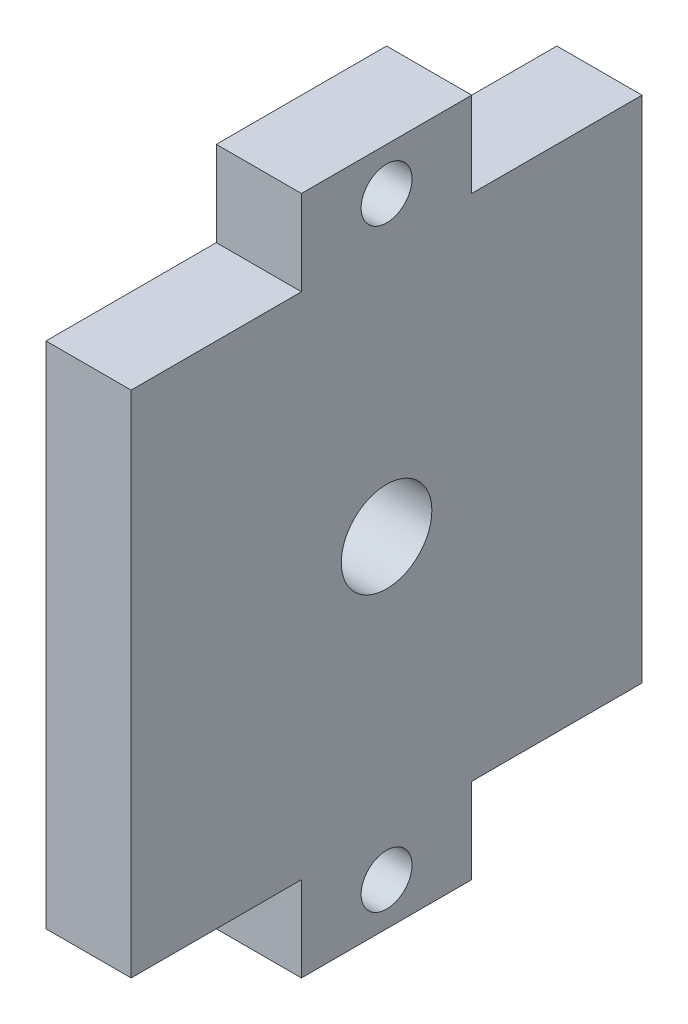
ISO-10303-21;
HEADER;
FILE_DESCRIPTION(('STEP AP214'),'2;1');
FILE_NAME('part.step','',(''),(''),'','','');
FILE_SCHEMA(('AUTOMOTIVE_DESIGN { 1 0 10303 214 1 1 1 1 }'));
ENDSEC;
DATA;
#1=APPLICATION_CONTEXT('core data for automotive mechanical design processes');
#2=APPLICATION_PROTOCOL_DEFINITION('international standard','automotive_design',2000,#1);
#3=PRODUCT_CONTEXT('',#1,'mechanical');
#4=PRODUCT('Part','Part','',(#3));
#5=PRODUCT_RELATED_PRODUCT_CATEGORY('part','',(#4));
#6=PRODUCT_DEFINITION_FORMATION('','',#4);
#7=PRODUCT_DEFINITION_CONTEXT('part definition',#1,'design');
#8=PRODUCT_DEFINITION('design','',#6,#7);
#9=PRODUCT_DEFINITION_SHAPE('','',#8);
#10=(LENGTH_UNIT() NAMED_UNIT(*) SI_UNIT(.MILLI.,.METRE.));
#11=(NAMED_UNIT(*) PLANE_ANGLE_UNIT() SI_UNIT($,.RADIAN.));
#12=(NAMED_UNIT(*) SI_UNIT($,.STERADIAN.) SOLID_ANGLE_UNIT());
#13=UNCERTAINTY_MEASURE_WITH_UNIT(LENGTH_MEASURE(1.E-05),#10,'distance_accuracy_value','');
#14=(GEOMETRIC_REPRESENTATION_CONTEXT(3) GLOBAL_UNCERTAINTY_ASSIGNED_CONTEXT((#13)) GLOBAL_UNIT_ASSIGNED_CONTEXT((#10,
#11,#12)) REPRESENTATION_CONTEXT('',''));
#15=CARTESIAN_POINT('',(0.,0.,0.));
#16=DIRECTION('',(0.,0.,1.));
#17=DIRECTION('',(1.,0.,0.));
#18=AXIS2_PLACEMENT_3D('',#15,#16,#17);
#19=CARTESIAN_POINT('',(3.175,0.,0.));
#20=DIRECTION('',(-1.,0.,0.));
#21=DIRECTION('',(0.,0.,1.));
#22=AXIS2_PLACEMENT_3D('',#19,#20,#21);
#23=PLANE('',#22);
#24=CARTESIAN_POINT('',(3.175,0.,0.));
#25=DIRECTION('',(1.,0.,0.));
#26=DIRECTION('',(0.,0.,-1.));
#27=AXIS2_PLACEMENT_3D('',#24,#25,#26);
#28=CIRCLE('',#27,3.37819999999999);
#29=CARTESIAN_POINT('',(3.175,0.,-3.37819999999999));
#30=VERTEX_POINT('',#29);
#31=EDGE_CURVE('E229',#30,#30,#28,.T.);
#32=ORIENTED_EDGE('',*,*,#31,.F.);
#33=EDGE_LOOP('',(#32));
#34=FACE_BOUND('',#33,.T.);
#35=CARTESIAN_POINT('',(3.175,22.1615,0.));
#36=DIRECTION('',(1.,0.,0.));
#37=DIRECTION('',(0.,0.,-1.));
#38=AXIS2_PLACEMENT_3D('',#35,#36,#37);
#39=CIRCLE('',#38,1.89865);
#40=CARTESIAN_POINT('',(3.175,22.1615,-1.89865));
#41=VERTEX_POINT('',#40);
#42=EDGE_CURVE('E197',#41,#41,#39,.T.);
#43=ORIENTED_EDGE('',*,*,#42,.F.);
#44=EDGE_LOOP('',(#43));
#45=FACE_BOUND('',#44,.T.);
#46=DIRECTION('',(0.,0.,-1.));
#47=VECTOR('',#46,1.);
#48=CARTESIAN_POINT('',(3.175,-25.3365,19.05));
#49=LINE('',#48,#47);
#50=CARTESIAN_POINT('',(3.175,-25.3365,6.35));
#51=VERTEX_POINT('',#50);
#52=CARTESIAN_POINT('',(3.175,-25.3365,-6.35));
#53=VERTEX_POINT('',#52);
#54=EDGE_CURVE('E11',#51,#53,#49,.T.);
#55=ORIENTED_EDGE('',*,*,#54,.T.);
#56=DIRECTION('',(0.,-1.,0.));
#57=VECTOR('',#56,1.);
#58=CARTESIAN_POINT('',(3.175,-25.3365,-6.35));
#59=LINE('',#58,#57);
#60=CARTESIAN_POINT('',(3.175,-18.9865,-6.35));
#61=VERTEX_POINT('',#60);
#62=EDGE_CURVE('E128',#61,#53,#59,.T.);
#63=ORIENTED_EDGE('',*,*,#62,.F.);
#64=DIRECTION('',(0.,0.,1.));
#65=VECTOR('',#64,1.);
#66=CARTESIAN_POINT('',(3.175,-18.9865,-19.05));
#67=LINE('',#66,#65);
#68=CARTESIAN_POINT('',(3.175,-18.9865,-19.05));
#69=VERTEX_POINT('',#68);
#70=EDGE_CURVE('E140',#69,#61,#67,.T.);
#71=ORIENTED_EDGE('',*,*,#70,.F.);
#72=DIRECTION('',(0.,1.,0.));
#73=VECTOR('',#72,1.);
#74=CARTESIAN_POINT('',(3.175,-25.3365,-19.05));
#75=LINE('',#74,#73);
#76=CARTESIAN_POINT('',(3.175,18.9865,-19.05));
#77=VERTEX_POINT('',#76);
#78=EDGE_CURVE('E144',#69,#77,#75,.T.);
#79=ORIENTED_EDGE('',*,*,#78,.T.);
#80=DIRECTION('',(0.,0.,1.));
#81=VECTOR('',#80,1.);
#82=CARTESIAN_POINT('',(3.175,18.9865,-19.05));
#83=LINE('',#82,#81);
#84=CARTESIAN_POINT('',(3.175,18.9865,-6.35));
#85=VERTEX_POINT('',#84);
#86=EDGE_CURVE('E181',#77,#85,#83,.T.);
#87=ORIENTED_EDGE('',*,*,#86,.T.);
#88=DIRECTION('',(0.,1.,0.));
#89=VECTOR('',#88,1.);
#90=CARTESIAN_POINT('',(3.175,25.3365,-6.35));
#91=LINE('',#90,#89);
#92=CARTESIAN_POINT('',(3.175,25.3365,-6.35));
#93=VERTEX_POINT('',#92);
#94=EDGE_CURVE('E187',#85,#93,#91,.T.);
#95=ORIENTED_EDGE('',*,*,#94,.T.);
#96=DIRECTION('',(0.,0.,1.));
#97=VECTOR('',#96,1.);
#98=CARTESIAN_POINT('',(3.175,25.3365,19.05));
#99=LINE('',#98,#97);
#100=CARTESIAN_POINT('',(3.175,25.3365,6.35));
#101=VERTEX_POINT('',#100);
#102=EDGE_CURVE('E146',#93,#101,#99,.T.);
#103=ORIENTED_EDGE('',*,*,#102,.T.);
#104=DIRECTION('',(0.,1.,0.));
#105=VECTOR('',#104,1.);
#106=CARTESIAN_POINT('',(3.175,25.3365,6.35));
#107=LINE('',#106,#105);
#108=CARTESIAN_POINT('',(3.175,18.9865,6.35));
#109=VERTEX_POINT('',#108);
#110=EDGE_CURVE('E165',#109,#101,#107,.T.);
#111=ORIENTED_EDGE('',*,*,#110,.F.);
#112=DIRECTION('',(0.,0.,-1.));
#113=VECTOR('',#112,1.);
#114=CARTESIAN_POINT('',(3.175,18.9865,19.05));
#115=LINE('',#114,#113);
#116=CARTESIAN_POINT('',(3.175,18.9865,19.05));
#117=VERTEX_POINT('',#116);
#118=EDGE_CURVE('E171',#117,#109,#115,.T.);
#119=ORIENTED_EDGE('',*,*,#118,.F.);
#120=DIRECTION('',(0.,-1.,0.));
#121=VECTOR('',#120,1.);
#122=CARTESIAN_POINT('',(3.175,-25.3365,19.05));
#123=LINE('',#122,#121);
#124=CARTESIAN_POINT('',(3.175,-18.9865,19.05));
#125=VERTEX_POINT('',#124);
#126=EDGE_CURVE('E41',#117,#125,#123,.T.);
#127=ORIENTED_EDGE('',*,*,#126,.T.);
#128=DIRECTION('',(0.,0.,-1.));
#129=VECTOR('',#128,1.);
#130=CARTESIAN_POINT('',(3.175,-18.9865,19.05));
#131=LINE('',#130,#129);
#132=CARTESIAN_POINT('',(3.175,-18.9865,6.35));
#133=VERTEX_POINT('',#132);
#134=EDGE_CURVE('E203',#125,#133,#131,.T.);
#135=ORIENTED_EDGE('',*,*,#134,.T.);
#136=DIRECTION('',(0.,-1.,0.));
#137=VECTOR('',#136,1.);
#138=CARTESIAN_POINT('',(3.175,-25.3365,6.35));
#139=LINE('',#138,#137);
#140=EDGE_CURVE('E209',#133,#51,#139,.T.);
#141=ORIENTED_EDGE('',*,*,#140,.T.);
#142=EDGE_LOOP('',(#55,#63,#71,#79,#87,#95,#103,#111,#119,#127,#135,#141));
#143=FACE_BOUND('',#142,.T.);
#144=CARTESIAN_POINT('',(3.175,-22.1615,0.));
#145=DIRECTION('',(1.,0.,0.));
#146=DIRECTION('',(0.,0.,-1.));
#147=AXIS2_PLACEMENT_3D('',#144,#145,#146);
#148=CIRCLE('',#147,1.89865);
#149=CARTESIAN_POINT('',(3.175,-22.1615,-1.89865));
#150=VERTEX_POINT('',#149);
#151=EDGE_CURVE('E223',#150,#150,#148,.T.);
#152=ORIENTED_EDGE('',*,*,#151,.F.);
#153=EDGE_LOOP('',(#152));
#154=FACE_BOUND('',#153,.T.);
#155=ADVANCED_FACE('F32',(#34,#45,#143,#154),#23,.F.);
#156=CARTESIAN_POINT('',(-3.175,0.,0.));
#157=DIRECTION('',(-1.,0.,0.));
#158=DIRECTION('',(0.,0.,1.));
#159=AXIS2_PLACEMENT_3D('',#156,#157,#158);
#160=PLANE('',#159);
#161=CARTESIAN_POINT('',(-3.175,0.,0.));
#162=DIRECTION('',(-1.,0.,0.));
#163=DIRECTION('',(0.,0.,1.));
#164=AXIS2_PLACEMENT_3D('',#161,#162,#163);
#165=CIRCLE('',#164,3.37819999999999);
#166=CARTESIAN_POINT('',(-3.175,0.,3.37819999999999));
#167=VERTEX_POINT('',#166);
#168=EDGE_CURVE('E226',#167,#167,#165,.T.);
#169=ORIENTED_EDGE('',*,*,#168,.F.);
#170=EDGE_LOOP('',(#169));
#171=FACE_BOUND('',#170,.T.);
#172=CARTESIAN_POINT('',(-3.175,-22.1615,0.));
#173=DIRECTION('',(-1.,0.,0.));
#174=DIRECTION('',(0.,0.,1.));
#175=AXIS2_PLACEMENT_3D('',#172,#173,#174);
#176=CIRCLE('',#175,1.89865);
#177=CARTESIAN_POINT('',(-3.175,-22.1615,1.89865));
#178=VERTEX_POINT('',#177);
#179=EDGE_CURVE('E36',#178,#178,#176,.T.);
#180=ORIENTED_EDGE('',*,*,#179,.F.);
#181=EDGE_LOOP('',(#180));
#182=FACE_BOUND('',#181,.T.);
#183=DIRECTION('',(0.,-1.,0.));
#184=VECTOR('',#183,1.);
#185=CARTESIAN_POINT('',(-3.175,-25.3365,-6.35));
#186=LINE('',#185,#184);
#187=CARTESIAN_POINT('',(-3.175,-18.9865,-6.35));
#188=VERTEX_POINT('',#187);
#189=CARTESIAN_POINT('',(-3.175,-25.3365,-6.34999999999999));
#190=VERTEX_POINT('',#189);
#191=EDGE_CURVE('E126',#188,#190,#186,.T.);
#192=ORIENTED_EDGE('',*,*,#191,.T.);
#193=DIRECTION('',(0.,0.,-1.));
#194=VECTOR('',#193,1.);
#195=CARTESIAN_POINT('',(-3.175,-25.3365,19.05));
#196=LINE('',#195,#194);
#197=CARTESIAN_POINT('',(-3.175,-25.3365,6.35));
#198=VERTEX_POINT('',#197);
#199=EDGE_CURVE('E138',#198,#190,#196,.T.);
#200=ORIENTED_EDGE('',*,*,#199,.F.);
#201=DIRECTION('',(0.,-1.,0.));
#202=VECTOR('',#201,1.);
#203=CARTESIAN_POINT('',(-3.175,-25.3365,6.35));
#204=LINE('',#203,#202);
#205=CARTESIAN_POINT('',(-3.175,-18.9865,6.35));
#206=VERTEX_POINT('',#205);
#207=EDGE_CURVE('E57',#206,#198,#204,.T.);
#208=ORIENTED_EDGE('',*,*,#207,.F.);
#209=DIRECTION('',(0.,0.,-1.));
#210=VECTOR('',#209,1.);
#211=CARTESIAN_POINT('',(-3.175,-18.9865,19.05));
#212=LINE('',#211,#210);
#213=CARTESIAN_POINT('',(-3.175,-18.9865,19.05));
#214=VERTEX_POINT('',#213);
#215=EDGE_CURVE('E212',#214,#206,#212,.T.);
#216=ORIENTED_EDGE('',*,*,#215,.F.);
#217=DIRECTION('',(0.,-1.,0.));
#218=VECTOR('',#217,1.);
#219=CARTESIAN_POINT('',(-3.175,-25.3365,19.05));
#220=LINE('',#219,#218);
#221=CARTESIAN_POINT('',(-3.175,18.9865,19.05));
#222=VERTEX_POINT('',#221);
#223=EDGE_CURVE('E145',#222,#214,#220,.T.);
#224=ORIENTED_EDGE('',*,*,#223,.F.);
#225=DIRECTION('',(0.,0.,-1.));
#226=VECTOR('',#225,1.);
#227=CARTESIAN_POINT('',(-3.175,18.9865,19.05));
#228=LINE('',#227,#226);
#229=CARTESIAN_POINT('',(-3.175,18.9865,6.35));
#230=VERTEX_POINT('',#229);
#231=EDGE_CURVE('E154',#222,#230,#228,.T.);
#232=ORIENTED_EDGE('',*,*,#231,.T.);
#233=DIRECTION('',(0.,1.,0.));
#234=VECTOR('',#233,1.);
#235=CARTESIAN_POINT('',(-3.175,25.3365,6.35));
#236=LINE('',#235,#234);
#237=CARTESIAN_POINT('',(-3.175,25.3365,6.35));
#238=VERTEX_POINT('',#237);
#239=EDGE_CURVE('E174',#230,#238,#236,.T.);
#240=ORIENTED_EDGE('',*,*,#239,.T.);
#241=DIRECTION('',(0.,0.,1.));
#242=VECTOR('',#241,1.);
#243=CARTESIAN_POINT('',(-3.175,25.3365,19.05));
#244=LINE('',#243,#242);
#245=CARTESIAN_POINT('',(-3.175,25.3365,-6.35));
#246=VERTEX_POINT('',#245);
#247=EDGE_CURVE('E149',#246,#238,#244,.T.);
#248=ORIENTED_EDGE('',*,*,#247,.F.);
#249=DIRECTION('',(0.,1.,0.));
#250=VECTOR('',#249,1.);
#251=CARTESIAN_POINT('',(-3.175,25.3365,-6.35));
#252=LINE('',#251,#250);
#253=CARTESIAN_POINT('',(-3.175,18.9865,-6.35));
#254=VERTEX_POINT('',#253);
#255=EDGE_CURVE('E192',#254,#246,#252,.T.);
#256=ORIENTED_EDGE('',*,*,#255,.F.);
#257=DIRECTION('',(0.,0.,1.));
#258=VECTOR('',#257,1.);
#259=CARTESIAN_POINT('',(-3.175,18.9865,-19.05));
#260=LINE('',#259,#258);
#261=CARTESIAN_POINT('',(-3.175,18.9865,-19.05));
#262=VERTEX_POINT('',#261);
#263=EDGE_CURVE('E190',#262,#254,#260,.T.);
#264=ORIENTED_EDGE('',*,*,#263,.F.);
#265=DIRECTION('',(0.,1.,0.));
#266=VECTOR('',#265,1.);
#267=CARTESIAN_POINT('',(-3.175,-25.3365,-19.05));
#268=LINE('',#267,#266);
#269=CARTESIAN_POINT('',(-3.175,-18.9865,-19.05));
#270=VERTEX_POINT('',#269);
#271=EDGE_CURVE('E153',#270,#262,#268,.T.);
#272=ORIENTED_EDGE('',*,*,#271,.F.);
#273=DIRECTION('',(0.,0.,1.));
#274=VECTOR('',#273,1.);
#275=CARTESIAN_POINT('',(-3.175,-18.9865,-19.05));
#276=LINE('',#275,#274);
#277=EDGE_CURVE('E49',#270,#188,#276,.T.);
#278=ORIENTED_EDGE('',*,*,#277,.T.);
#279=EDGE_LOOP('',(#192,#200,#208,#216,#224,#232,#240,#248,#256,#264,#272,#278));
#280=FACE_BOUND('',#279,.T.);
#281=CARTESIAN_POINT('',(-3.175,22.1615,0.));
#282=DIRECTION('',(-1.,0.,0.));
#283=DIRECTION('',(0.,0.,1.));
#284=AXIS2_PLACEMENT_3D('',#281,#282,#283);
#285=CIRCLE('',#284,1.89865);
#286=CARTESIAN_POINT('',(-3.175,22.1615,1.89865));
#287=VERTEX_POINT('',#286);
#288=EDGE_CURVE('E194',#287,#287,#285,.T.);
#289=ORIENTED_EDGE('',*,*,#288,.F.);
#290=EDGE_LOOP('',(#289));
#291=FACE_BOUND('',#290,.T.);
#292=ADVANCED_FACE('F136',(#171,#182,#280,#291),#160,.T.);
#293=CARTESIAN_POINT('',(3.175,-25.3365,19.05));
#294=DIRECTION('',(0.,0.,-1.));
#295=DIRECTION('',(-1.,0.,0.));
#296=AXIS2_PLACEMENT_3D('',#293,#294,#295);
#297=PLANE('',#296);
#298=DIRECTION('',(1.,0.,0.));
#299=VECTOR('',#298,1.);
#300=CARTESIAN_POINT('',(-3.176,-18.9865,19.05));
#301=LINE('',#300,#299);
#302=EDGE_CURVE('E200',#214,#125,#301,.T.);
#303=ORIENTED_EDGE('',*,*,#302,.T.);
#304=ORIENTED_EDGE('',*,*,#126,.F.);
#305=DIRECTION('',(1.,0.,0.));
#306=VECTOR('',#305,1.);
#307=CARTESIAN_POINT('',(-3.176,18.9865,19.05));
#308=LINE('',#307,#306);
#309=EDGE_CURVE('E162',#222,#117,#308,.T.);
#310=ORIENTED_EDGE('',*,*,#309,.F.);
#311=ORIENTED_EDGE('',*,*,#223,.T.);
#312=EDGE_LOOP('',(#303,#304,#310,#311));
#313=FACE_BOUND('',#312,.T.);
#314=ADVANCED_FACE('F289',(#313),#297,.F.);
#315=CARTESIAN_POINT('',(3.175,-25.3365,19.05));
#316=DIRECTION('',(0.,1.,0.));
#317=DIRECTION('',(0.,0.,1.));
#318=AXIS2_PLACEMENT_3D('',#315,#316,#317);
#319=PLANE('',#318);
#320=ORIENTED_EDGE('',*,*,#199,.T.);
#321=DIRECTION('',(1.,0.,0.));
#322=VECTOR('',#321,1.);
#323=CARTESIAN_POINT('',(-3.176,-25.3365,-6.35));
#324=LINE('',#323,#322);
#325=EDGE_CURVE('E123',#190,#53,#324,.T.);
#326=ORIENTED_EDGE('',*,*,#325,.T.);
#327=ORIENTED_EDGE('',*,*,#54,.F.);
#328=DIRECTION('',(1.,0.,0.));
#329=VECTOR('',#328,1.);
#330=CARTESIAN_POINT('',(-3.176,-25.3365,6.35));
#331=LINE('',#330,#329);
#332=EDGE_CURVE('E143',#198,#51,#331,.T.);
#333=ORIENTED_EDGE('',*,*,#332,.F.);
#334=EDGE_LOOP('',(#320,#326,#327,#333));
#335=FACE_BOUND('',#334,.T.);
#336=ADVANCED_FACE('F142',(#335),#319,.F.);
#337=CARTESIAN_POINT('',(3.175,-25.3365,-19.05));
#338=DIRECTION('',(0.,0.,1.));
#339=DIRECTION('',(1.,0.,0.));
#340=AXIS2_PLACEMENT_3D('',#337,#338,#339);
#341=PLANE('',#340);
#342=ORIENTED_EDGE('',*,*,#78,.F.);
#343=DIRECTION('',(1.,0.,0.));
#344=VECTOR('',#343,1.);
#345=CARTESIAN_POINT('',(-3.176,-18.9865,-19.05));
#346=LINE('',#345,#344);
#347=EDGE_CURVE('E217',#270,#69,#346,.T.);
#348=ORIENTED_EDGE('',*,*,#347,.F.);
#349=ORIENTED_EDGE('',*,*,#271,.T.);
#350=DIRECTION('',(1.,0.,0.));
#351=VECTOR('',#350,1.);
#352=CARTESIAN_POINT('',(-3.176,18.9865,-19.05));
#353=LINE('',#352,#351);
#354=EDGE_CURVE('E177',#262,#77,#353,.T.);
#355=ORIENTED_EDGE('',*,*,#354,.T.);
#356=EDGE_LOOP('',(#342,#348,#349,#355));
#357=FACE_BOUND('',#356,.T.);
#358=ADVANCED_FACE('F34',(#357),#341,.F.);
#359=CARTESIAN_POINT('',(3.175,25.3365,19.05));
#360=DIRECTION('',(0.,-1.,0.));
#361=DIRECTION('',(0.,0.,-1.));
#362=AXIS2_PLACEMENT_3D('',#359,#360,#361);
#363=PLANE('',#362);
#364=DIRECTION('',(1.,0.,0.));
#365=VECTOR('',#364,1.);
#366=CARTESIAN_POINT('',(-3.176,25.3365,-6.35));
#367=LINE('',#366,#365);
#368=EDGE_CURVE('E178',#246,#93,#367,.T.);
#369=ORIENTED_EDGE('',*,*,#368,.F.);
#370=ORIENTED_EDGE('',*,*,#247,.T.);
#371=DIRECTION('',(1.,0.,0.));
#372=VECTOR('',#371,1.);
#373=CARTESIAN_POINT('',(-3.176,25.3365,6.35));
#374=LINE('',#373,#372);
#375=EDGE_CURVE('E161',#238,#101,#374,.T.);
#376=ORIENTED_EDGE('',*,*,#375,.T.);
#377=ORIENTED_EDGE('',*,*,#102,.F.);
#378=EDGE_LOOP('',(#369,#370,#376,#377));
#379=FACE_BOUND('',#378,.T.);
#380=ADVANCED_FACE('F282',(#379),#363,.F.);
#381=CARTESIAN_POINT('',(-3.176,25.3365,6.35));
#382=DIRECTION('',(0.,0.,-1.));
#383=DIRECTION('',(-1.,0.,0.));
#384=AXIS2_PLACEMENT_3D('',#381,#382,#383);
#385=PLANE('',#384);
#386=DIRECTION('',(1.,0.,0.));
#387=VECTOR('',#386,1.);
#388=CARTESIAN_POINT('',(-3.176,18.9865,6.35));
#389=LINE('',#388,#387);
#390=EDGE_CURVE('E164',#230,#109,#389,.T.);
#391=ORIENTED_EDGE('',*,*,#390,.T.);
#392=ORIENTED_EDGE('',*,*,#110,.T.);
#393=ORIENTED_EDGE('',*,*,#375,.F.);
#394=ORIENTED_EDGE('',*,*,#239,.F.);
#395=EDGE_LOOP('',(#391,#392,#393,#394));
#396=FACE_BOUND('',#395,.T.);
#397=ADVANCED_FACE('F279',(#396),#385,.F.);
#398=CARTESIAN_POINT('',(-3.176,18.9865,19.05));
#399=DIRECTION('',(0.,-1.,0.));
#400=DIRECTION('',(0.,0.,-1.));
#401=AXIS2_PLACEMENT_3D('',#398,#399,#400);
#402=PLANE('',#401);
#403=ORIENTED_EDGE('',*,*,#309,.T.);
#404=ORIENTED_EDGE('',*,*,#118,.T.);
#405=ORIENTED_EDGE('',*,*,#390,.F.);
#406=ORIENTED_EDGE('',*,*,#231,.F.);
#407=EDGE_LOOP('',(#403,#404,#405,#406));
#408=FACE_BOUND('',#407,.T.);
#409=ADVANCED_FACE('F274',(#408),#402,.F.);
#410=CARTESIAN_POINT('',(-3.176,18.9865,-19.05));
#411=DIRECTION('',(0.,1.,0.));
#412=DIRECTION('',(0.,0.,1.));
#413=AXIS2_PLACEMENT_3D('',#410,#411,#412);
#414=PLANE('',#413);
#415=ORIENTED_EDGE('',*,*,#263,.T.);
#416=DIRECTION('',(1.,0.,0.));
#417=VECTOR('',#416,1.);
#418=CARTESIAN_POINT('',(-3.176,18.9865,-6.35));
#419=LINE('',#418,#417);
#420=EDGE_CURVE('E180',#254,#85,#419,.T.);
#421=ORIENTED_EDGE('',*,*,#420,.T.);
#422=ORIENTED_EDGE('',*,*,#86,.F.);
#423=ORIENTED_EDGE('',*,*,#354,.F.);
#424=EDGE_LOOP('',(#415,#421,#422,#423));
#425=FACE_BOUND('',#424,.T.);
#426=ADVANCED_FACE('F271',(#425),#414,.T.);
#427=CARTESIAN_POINT('',(-3.176,25.3365,-6.35));
#428=DIRECTION('',(0.,0.,-1.));
#429=DIRECTION('',(-1.,0.,0.));
#430=AXIS2_PLACEMENT_3D('',#427,#428,#429);
#431=PLANE('',#430);
#432=ORIENTED_EDGE('',*,*,#255,.T.);
#433=ORIENTED_EDGE('',*,*,#368,.T.);
#434=ORIENTED_EDGE('',*,*,#94,.F.);
#435=ORIENTED_EDGE('',*,*,#420,.F.);
#436=EDGE_LOOP('',(#432,#433,#434,#435));
#437=FACE_BOUND('',#436,.T.);
#438=ADVANCED_FACE('F269',(#437),#431,.T.);
#439=CARTESIAN_POINT('',(3.175,22.1615,0.));
#440=DIRECTION('',(1.,0.,0.));
#441=DIRECTION('',(0.,0.,-1.));
#442=AXIS2_PLACEMENT_3D('',#439,#440,#441);
#443=CYLINDRICAL_SURFACE('',#442,1.89865);
#444=ORIENTED_EDGE('',*,*,#288,.T.);
#445=EDGE_LOOP('',(#444));
#446=FACE_BOUND('',#445,.T.);
#447=ORIENTED_EDGE('',*,*,#42,.T.);
#448=EDGE_LOOP('',(#447));
#449=FACE_BOUND('',#448,.T.);
#450=ADVANCED_FACE('F263',(#446,#449),#443,.F.);
#451=CARTESIAN_POINT('',(-3.176,-18.9865,19.05));
#452=DIRECTION('',(0.,-1.,0.));
#453=DIRECTION('',(0.,0.,-1.));
#454=AXIS2_PLACEMENT_3D('',#451,#452,#453);
#455=PLANE('',#454);
#456=ORIENTED_EDGE('',*,*,#215,.T.);
#457=DIRECTION('',(1.,0.,0.));
#458=VECTOR('',#457,1.);
#459=CARTESIAN_POINT('',(-3.176,-18.9865,6.35));
#460=LINE('',#459,#458);
#461=EDGE_CURVE('E202',#206,#133,#460,.T.);
#462=ORIENTED_EDGE('',*,*,#461,.T.);
#463=ORIENTED_EDGE('',*,*,#134,.F.);
#464=ORIENTED_EDGE('',*,*,#302,.F.);
#465=EDGE_LOOP('',(#456,#462,#463,#464));
#466=FACE_BOUND('',#465,.T.);
#467=ADVANCED_FACE('F260',(#466),#455,.T.);
#468=CARTESIAN_POINT('',(-3.176,-25.3365,6.35));
#469=DIRECTION('',(0.,0.,1.));
#470=DIRECTION('',(1.,0.,0.));
#471=AXIS2_PLACEMENT_3D('',#468,#469,#470);
#472=PLANE('',#471);
#473=ORIENTED_EDGE('',*,*,#207,.T.);
#474=ORIENTED_EDGE('',*,*,#332,.T.);
#475=ORIENTED_EDGE('',*,*,#140,.F.);
#476=ORIENTED_EDGE('',*,*,#461,.F.);
#477=EDGE_LOOP('',(#473,#474,#475,#476));
#478=FACE_BOUND('',#477,.T.);
#479=ADVANCED_FACE('F258',(#478),#472,.T.);
#480=CARTESIAN_POINT('',(-3.176,-25.3365,-6.35));
#481=DIRECTION('',(0.,0.,1.));
#482=DIRECTION('',(1.,0.,0.));
#483=AXIS2_PLACEMENT_3D('',#480,#481,#482);
#484=PLANE('',#483);
#485=DIRECTION('',(1.,0.,0.));
#486=VECTOR('',#485,1.);
#487=CARTESIAN_POINT('',(-3.176,-18.9865,-6.35));
#488=LINE('',#487,#486);
#489=EDGE_CURVE('E132',#188,#61,#488,.T.);
#490=ORIENTED_EDGE('',*,*,#489,.T.);
#491=ORIENTED_EDGE('',*,*,#62,.T.);
#492=ORIENTED_EDGE('',*,*,#325,.F.);
#493=ORIENTED_EDGE('',*,*,#191,.F.);
#494=EDGE_LOOP('',(#490,#491,#492,#493));
#495=FACE_BOUND('',#494,.T.);
#496=ADVANCED_FACE('F125',(#495),#484,.F.);
#497=CARTESIAN_POINT('',(-3.176,-18.9865,-19.05));
#498=DIRECTION('',(0.,1.,0.));
#499=DIRECTION('',(0.,0.,1.));
#500=AXIS2_PLACEMENT_3D('',#497,#498,#499);
#501=PLANE('',#500);
#502=ORIENTED_EDGE('',*,*,#347,.T.);
#503=ORIENTED_EDGE('',*,*,#70,.T.);
#504=ORIENTED_EDGE('',*,*,#489,.F.);
#505=ORIENTED_EDGE('',*,*,#277,.F.);
#506=EDGE_LOOP('',(#502,#503,#504,#505));
#507=FACE_BOUND('',#506,.T.);
#508=ADVANCED_FACE('F246',(#507),#501,.F.);
#509=CARTESIAN_POINT('',(3.175,-22.1615,0.));
#510=DIRECTION('',(1.,0.,0.));
#511=DIRECTION('',(0.,0.,-1.));
#512=AXIS2_PLACEMENT_3D('',#509,#510,#511);
#513=CYLINDRICAL_SURFACE('',#512,1.89865);
#514=ORIENTED_EDGE('',*,*,#179,.T.);
#515=EDGE_LOOP('',(#514));
#516=FACE_BOUND('',#515,.T.);
#517=ORIENTED_EDGE('',*,*,#151,.T.);
#518=EDGE_LOOP('',(#517));
#519=FACE_BOUND('',#518,.T.);
#520=ADVANCED_FACE('F244',(#516,#519),#513,.F.);
#521=CARTESIAN_POINT('',(3.175,0.,0.));
#522=DIRECTION('',(1.,0.,0.));
#523=DIRECTION('',(0.,0.,-1.));
#524=AXIS2_PLACEMENT_3D('',#521,#522,#523);
#525=CYLINDRICAL_SURFACE('',#524,3.37819999999999);
#526=ORIENTED_EDGE('',*,*,#31,.T.);
#527=EDGE_LOOP('',(#526));
#528=FACE_BOUND('',#527,.T.);
#529=ORIENTED_EDGE('',*,*,#168,.T.);
#530=EDGE_LOOP('',(#529));
#531=FACE_BOUND('',#530,.T.);
#532=ADVANCED_FACE('F233',(#528,#531),#525,.F.);
#533=CLOSED_SHELL('',(#155,#292,#314,#336,#358,#380,#397,#409,#426,#438,#450,#467,#479,#496,
#508,#520,#532));
#534=MANIFOLD_SOLID_BREP('B2',#533);
#535=ADVANCED_BREP_SHAPE_REPRESENTATION('',(#18,#534),#14);
#536=SHAPE_DEFINITION_REPRESENTATION(#9,#535);
ENDSEC;
END-ISO-10303-21;
